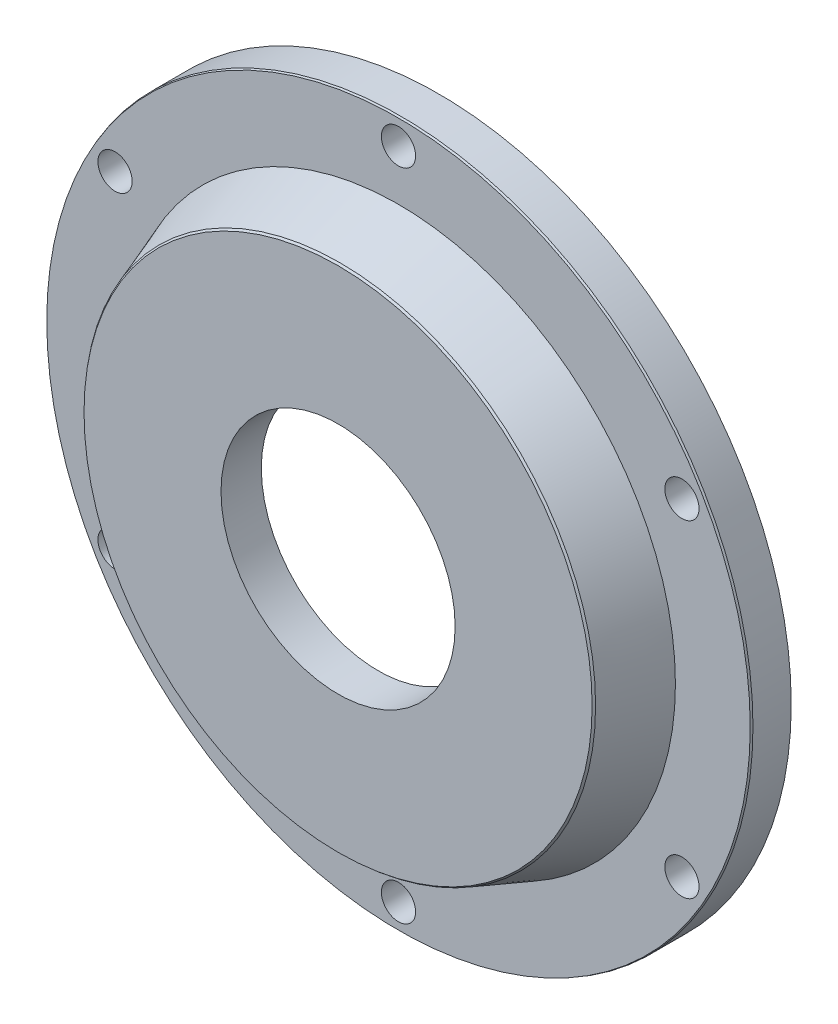
ISO-10303-21;
HEADER;
FILE_DESCRIPTION(('STEP AP214'),'2;1');
FILE_NAME('part.step','',(''),(''),'','','');
FILE_SCHEMA(('AUTOMOTIVE_DESIGN { 1 0 10303 214 1 1 1 1 }'));
ENDSEC;
DATA;
#1=APPLICATION_CONTEXT('core data for automotive mechanical design processes');
#2=APPLICATION_PROTOCOL_DEFINITION('international standard','automotive_design',2000,#1);
#3=PRODUCT_CONTEXT('',#1,'mechanical');
#4=PRODUCT('Part','Part','',(#3));
#5=PRODUCT_RELATED_PRODUCT_CATEGORY('part','',(#4));
#6=PRODUCT_DEFINITION_FORMATION('','',#4);
#7=PRODUCT_DEFINITION_CONTEXT('part definition',#1,'design');
#8=PRODUCT_DEFINITION('design','',#6,#7);
#9=PRODUCT_DEFINITION_SHAPE('','',#8);
#10=(LENGTH_UNIT() NAMED_UNIT(*) SI_UNIT(.MILLI.,.METRE.));
#11=(NAMED_UNIT(*) PLANE_ANGLE_UNIT() SI_UNIT($,.RADIAN.));
#12=(NAMED_UNIT(*) SI_UNIT($,.STERADIAN.) SOLID_ANGLE_UNIT());
#13=UNCERTAINTY_MEASURE_WITH_UNIT(LENGTH_MEASURE(1.E-05),#10,'distance_accuracy_value','');
#14=(GEOMETRIC_REPRESENTATION_CONTEXT(3) GLOBAL_UNCERTAINTY_ASSIGNED_CONTEXT((#13)) GLOBAL_UNIT_ASSIGNED_CONTEXT((#10,
#11,#12)) REPRESENTATION_CONTEXT('',''));
#15=CARTESIAN_POINT('',(0.,0.,0.));
#16=DIRECTION('',(0.,0.,1.));
#17=DIRECTION('',(1.,0.,0.));
#18=AXIS2_PLACEMENT_3D('',#15,#16,#17);
#19=CARTESIAN_POINT('',(0.,0.,-10.));
#20=DIRECTION('',(0.,0.,1.));
#21=DIRECTION('',(1.,0.,0.));
#22=AXIS2_PLACEMENT_3D('',#19,#20,#21);
#23=CYLINDRICAL_SURFACE('',#22,35.);
#24=CARTESIAN_POINT('',(0.,0.,-6.19999999999998));
#25=DIRECTION('',(0.,0.,1.));
#26=DIRECTION('',(1.,0.,0.));
#27=AXIS2_PLACEMENT_3D('',#24,#25,#26);
#28=CIRCLE('',#27,35.);
#29=CARTESIAN_POINT('',(-35.,0.,-6.19999999999998));
#30=VERTEX_POINT('',#29);
#31=EDGE_CURVE('E10',#30,#30,#28,.F.);
#32=ORIENTED_EDGE('',*,*,#31,.T.);
#33=EDGE_LOOP('',(#32));
#34=FACE_BOUND('',#33,.T.);
#35=CARTESIAN_POINT('',(0.,0.,-10.));
#36=DIRECTION('',(0.,0.,1.));
#37=DIRECTION('',(1.,0.,0.));
#38=AXIS2_PLACEMENT_3D('',#35,#36,#37);
#39=CIRCLE('',#38,35.);
#40=CARTESIAN_POINT('',(35.,0.,-10.));
#41=VERTEX_POINT('',#40);
#42=EDGE_CURVE('E70',#41,#41,#39,.T.);
#43=ORIENTED_EDGE('',*,*,#42,.T.);
#44=EDGE_LOOP('',(#43));
#45=FACE_BOUND('',#44,.T.);
#46=ADVANCED_FACE('F41',(#34,#45),#23,.T.);
#47=CARTESIAN_POINT('',(0.,0.,-10.));
#48=DIRECTION('',(0.,0.,1.));
#49=DIRECTION('',(1.,0.,0.));
#50=AXIS2_PLACEMENT_3D('',#47,#48,#49);
#51=PLANE('',#50);
#52=CARTESIAN_POINT('',(28.1458256229941,16.2500000000003,-10.));
#53=DIRECTION('',(0.,0.,1.));
#54=DIRECTION('',(1.,0.,0.));
#55=AXIS2_PLACEMENT_3D('',#52,#53,#54);
#56=CIRCLE('',#55,1.69999999999999);
#57=CARTESIAN_POINT('',(29.8458256229941,16.2500000000003,-10.));
#58=VERTEX_POINT('',#57);
#59=EDGE_CURVE('E113',#58,#58,#56,.T.);
#60=ORIENTED_EDGE('',*,*,#59,.T.);
#61=EDGE_LOOP('',(#60));
#62=FACE_BOUND('',#61,.T.);
#63=CARTESIAN_POINT('',(28.1458256229944,-16.2499999999997,-10.));
#64=DIRECTION('',(0.,0.,1.));
#65=DIRECTION('',(1.,0.,0.));
#66=AXIS2_PLACEMENT_3D('',#63,#64,#65);
#67=CIRCLE('',#66,1.69999999999999);
#68=CARTESIAN_POINT('',(29.8458256229944,-16.2499999999997,-10.));
#69=VERTEX_POINT('',#68);
#70=EDGE_CURVE('E110',#69,#69,#67,.T.);
#71=ORIENTED_EDGE('',*,*,#70,.T.);
#72=EDGE_LOOP('',(#71));
#73=FACE_BOUND('',#72,.T.);
#74=CARTESIAN_POINT('',(0.,-32.5,-10.));
#75=DIRECTION('',(0.,0.,1.));
#76=DIRECTION('',(1.,0.,0.));
#77=AXIS2_PLACEMENT_3D('',#74,#75,#76);
#78=CIRCLE('',#77,1.69999999999999);
#79=CARTESIAN_POINT('',(1.69999999999999,-32.5,-10.));
#80=VERTEX_POINT('',#79);
#81=EDGE_CURVE('E103',#80,#80,#78,.T.);
#82=ORIENTED_EDGE('',*,*,#81,.T.);
#83=EDGE_LOOP('',(#82));
#84=FACE_BOUND('',#83,.T.);
#85=CARTESIAN_POINT('',(-28.1458256229942,-16.2500000000001,-10.));
#86=DIRECTION('',(0.,0.,1.));
#87=DIRECTION('',(1.,0.,0.));
#88=AXIS2_PLACEMENT_3D('',#85,#86,#87);
#89=CIRCLE('',#88,1.69999999999999);
#90=CARTESIAN_POINT('',(-26.4458256229942,-16.2500000000001,-10.));
#91=VERTEX_POINT('',#90);
#92=EDGE_CURVE('E94',#91,#91,#89,.T.);
#93=ORIENTED_EDGE('',*,*,#92,.T.);
#94=EDGE_LOOP('',(#93));
#95=FACE_BOUND('',#94,.T.);
#96=CARTESIAN_POINT('',(-28.1458256229943,16.2499999999999,-10.));
#97=DIRECTION('',(0.,0.,1.));
#98=DIRECTION('',(1.,0.,0.));
#99=AXIS2_PLACEMENT_3D('',#96,#97,#98);
#100=CIRCLE('',#99,1.69999999999999);
#101=CARTESIAN_POINT('',(-26.4458256229943,16.2499999999999,-10.));
#102=VERTEX_POINT('',#101);
#103=EDGE_CURVE('E86',#102,#102,#100,.T.);
#104=ORIENTED_EDGE('',*,*,#103,.T.);
#105=EDGE_LOOP('',(#104));
#106=FACE_BOUND('',#105,.T.);
#107=CARTESIAN_POINT('',(0.,32.5,-10.));
#108=DIRECTION('',(0.,0.,1.));
#109=DIRECTION('',(1.,0.,0.));
#110=AXIS2_PLACEMENT_3D('',#107,#108,#109);
#111=CIRCLE('',#110,1.69999999999999);
#112=CARTESIAN_POINT('',(1.69999999999999,32.5,-10.));
#113=VERTEX_POINT('',#112);
#114=EDGE_CURVE('E82',#113,#113,#111,.T.);
#115=ORIENTED_EDGE('',*,*,#114,.T.);
#116=EDGE_LOOP('',(#115));
#117=FACE_BOUND('',#116,.T.);
#118=CARTESIAN_POINT('',(0.,0.,-10.));
#119=DIRECTION('',(0.,0.,1.));
#120=DIRECTION('',(1.,0.,0.));
#121=AXIS2_PLACEMENT_3D('',#118,#119,#120);
#122=CIRCLE('',#121,30.);
#123=CARTESIAN_POINT('',(-30.,0.,-10.));
#124=VERTEX_POINT('',#123);
#125=EDGE_CURVE('E64',#124,#124,#122,.T.);
#126=ORIENTED_EDGE('',*,*,#125,.T.);
#127=EDGE_LOOP('',(#126));
#128=FACE_BOUND('',#127,.T.);
#129=ORIENTED_EDGE('',*,*,#42,.F.);
#130=EDGE_LOOP('',(#129));
#131=FACE_BOUND('',#130,.T.);
#132=ADVANCED_FACE('F157',(#62,#73,#84,#95,#106,#117,#128,#131),#51,.F.);
#133=CARTESIAN_POINT('',(0.,0.,-4.));
#134=DIRECTION('',(0.,0.,-1.));
#135=DIRECTION('',(-1.,0.,0.));
#136=AXIS2_PLACEMENT_3D('',#133,#134,#135);
#137=CYLINDRICAL_SURFACE('',#136,26.5);
#138=CARTESIAN_POINT('',(0.,0.,-6.5));
#139=DIRECTION('',(0.,0.,1.));
#140=DIRECTION('',(1.,0.,0.));
#141=AXIS2_PLACEMENT_3D('',#138,#139,#140);
#142=CIRCLE('',#141,26.5);
#143=CARTESIAN_POINT('',(-26.5,0.,-6.5));
#144=VERTEX_POINT('',#143);
#145=EDGE_CURVE('E61',#144,#144,#142,.F.);
#146=ORIENTED_EDGE('',*,*,#145,.T.);
#147=EDGE_LOOP('',(#146));
#148=FACE_BOUND('',#147,.T.);
#149=CARTESIAN_POINT('',(0.,0.,-4.));
#150=DIRECTION('',(0.,0.,-1.));
#151=DIRECTION('',(-1.,0.,0.));
#152=AXIS2_PLACEMENT_3D('',#149,#150,#151);
#153=CIRCLE('',#152,26.5);
#154=CARTESIAN_POINT('',(-26.5,0.,-4.));
#155=VERTEX_POINT('',#154);
#156=EDGE_CURVE('E72',#155,#155,#153,.T.);
#157=ORIENTED_EDGE('',*,*,#156,.F.);
#158=EDGE_LOOP('',(#157));
#159=FACE_BOUND('',#158,.T.);
#160=ADVANCED_FACE('F165',(#148,#159),#137,.F.);
#161=CARTESIAN_POINT('',(0.,0.,-4.));
#162=DIRECTION('',(0.,0.,-1.));
#163=DIRECTION('',(-1.,0.,0.));
#164=AXIS2_PLACEMENT_3D('',#161,#162,#163);
#165=PLANE('',#164);
#166=CARTESIAN_POINT('',(0.,0.,-4.));
#167=DIRECTION('',(0.,0.,-1.));
#168=DIRECTION('',(-1.,0.,0.));
#169=AXIS2_PLACEMENT_3D('',#166,#167,#168);
#170=CIRCLE('',#169,11.625);
#171=CARTESIAN_POINT('',(-11.625,0.,-4.));
#172=VERTEX_POINT('',#171);
#173=EDGE_CURVE('E80',#172,#172,#170,.T.);
#174=ORIENTED_EDGE('',*,*,#173,.F.);
#175=EDGE_LOOP('',(#174));
#176=FACE_BOUND('',#175,.T.);
#177=ORIENTED_EDGE('',*,*,#156,.T.);
#178=EDGE_LOOP('',(#177));
#179=FACE_BOUND('',#178,.T.);
#180=ADVANCED_FACE('F175',(#176,#179),#165,.T.);
#181=CARTESIAN_POINT('',(0.,0.,-6.5));
#182=DIRECTION('',(0.,0.,-1.));
#183=DIRECTION('',(-1.,0.,0.));
#184=AXIS2_PLACEMENT_3D('',#181,#182,#183);
#185=CONICAL_SURFACE('',#184,26.5,0.785398163397449);
#186=CARTESIAN_POINT('',(-30.,0.,-10.));
#187=CARTESIAN_POINT('',(-29.9635416666667,0.,-9.96354166666667));
#188=CARTESIAN_POINT('',(-29.9270833333333,0.,-9.92708333333333));
#189=CARTESIAN_POINT('',(-29.8541666666667,0.,-9.85416666666667));
#190=CARTESIAN_POINT('',(-29.8177083333333,0.,-9.81770833333333));
#191=CARTESIAN_POINT('',(-29.7447916666667,0.,-9.74479166666667));
#192=CARTESIAN_POINT('',(-29.7083333333333,0.,-9.70833333333333));
#193=CARTESIAN_POINT('',(-29.6354166666667,0.,-9.63541666666667));
#194=CARTESIAN_POINT('',(-29.5989583333333,0.,-9.59895833333333));
#195=CARTESIAN_POINT('',(-29.5260416666667,0.,-9.52604166666667));
#196=CARTESIAN_POINT('',(-29.4895833333333,0.,-9.48958333333333));
#197=CARTESIAN_POINT('',(-29.4166666666667,0.,-9.41666666666667));
#198=CARTESIAN_POINT('',(-29.3802083333333,0.,-9.38020833333333));
#199=CARTESIAN_POINT('',(-29.3072916666667,0.,-9.30729166666667));
#200=CARTESIAN_POINT('',(-29.2708333333333,0.,-9.27083333333333));
#201=CARTESIAN_POINT('',(-29.1979166666667,0.,-9.19791666666667));
#202=CARTESIAN_POINT('',(-29.1614583333333,0.,-9.16145833333333));
#203=CARTESIAN_POINT('',(-29.0885416666667,0.,-9.08854166666666));
#204=CARTESIAN_POINT('',(-29.0520833333333,0.,-9.05208333333333));
#205=CARTESIAN_POINT('',(-28.9791666666667,0.,-8.97916666666667));
#206=CARTESIAN_POINT('',(-28.9427083333333,0.,-8.94270833333333));
#207=CARTESIAN_POINT('',(-28.8697916666667,0.,-8.86979166666666));
#208=CARTESIAN_POINT('',(-28.8333333333333,0.,-8.83333333333333));
#209=CARTESIAN_POINT('',(-28.7604166666667,0.,-8.76041666666667));
#210=CARTESIAN_POINT('',(-28.7239583333333,0.,-8.72395833333333));
#211=CARTESIAN_POINT('',(-28.6510416666667,0.,-8.65104166666666));
#212=CARTESIAN_POINT('',(-28.6145833333333,0.,-8.61458333333333));
#213=CARTESIAN_POINT('',(-28.5416666666667,0.,-8.54166666666667));
#214=CARTESIAN_POINT('',(-28.5052083333333,0.,-8.50520833333333));
#215=CARTESIAN_POINT('',(-28.4322916666667,0.,-8.43229166666667));
#216=CARTESIAN_POINT('',(-28.3958333333333,0.,-8.39583333333333));
#217=CARTESIAN_POINT('',(-28.3229166666667,0.,-8.32291666666667));
#218=CARTESIAN_POINT('',(-28.2864583333333,0.,-8.28645833333333));
#219=CARTESIAN_POINT('',(-28.2135416666667,0.,-8.21354166666667));
#220=CARTESIAN_POINT('',(-28.1770833333333,0.,-8.17708333333333));
#221=CARTESIAN_POINT('',(-28.1041666666667,0.,-8.10416666666666));
#222=CARTESIAN_POINT('',(-28.0677083333333,0.,-8.06770833333333));
#223=CARTESIAN_POINT('',(-27.9947916666667,0.,-7.99479166666667));
#224=CARTESIAN_POINT('',(-27.9583333333333,0.,-7.95833333333333));
#225=CARTESIAN_POINT('',(-27.8854166666667,0.,-7.88541666666667));
#226=CARTESIAN_POINT('',(-27.8489583333333,0.,-7.84895833333333));
#227=CARTESIAN_POINT('',(-27.7760416666667,0.,-7.77604166666666));
#228=CARTESIAN_POINT('',(-27.7395833333333,0.,-7.73958333333333));
#229=CARTESIAN_POINT('',(-27.6666666666667,0.,-7.66666666666667));
#230=CARTESIAN_POINT('',(-27.6302083333333,0.,-7.63020833333333));
#231=CARTESIAN_POINT('',(-27.5572916666667,0.,-7.55729166666666));
#232=CARTESIAN_POINT('',(-27.5208333333333,0.,-7.52083333333333));
#233=CARTESIAN_POINT('',(-27.4479166666667,0.,-7.44791666666667));
#234=CARTESIAN_POINT('',(-27.4114583333333,0.,-7.41145833333333));
#235=CARTESIAN_POINT('',(-27.3385416666667,0.,-7.33854166666666));
#236=CARTESIAN_POINT('',(-27.3020833333333,0.,-7.30208333333333));
#237=CARTESIAN_POINT('',(-27.2291666666667,0.,-7.22916666666667));
#238=CARTESIAN_POINT('',(-27.1927083333333,0.,-7.19270833333333));
#239=CARTESIAN_POINT('',(-27.1197916666667,0.,-7.11979166666666));
#240=CARTESIAN_POINT('',(-27.0833333333333,0.,-7.08333333333333));
#241=CARTESIAN_POINT('',(-27.0104166666667,0.,-7.01041666666667));
#242=CARTESIAN_POINT('',(-26.9739583333333,0.,-6.97395833333333));
#243=CARTESIAN_POINT('',(-26.9010416666667,0.,-6.90104166666666));
#244=CARTESIAN_POINT('',(-26.8645833333333,0.,-6.86458333333333));
#245=CARTESIAN_POINT('',(-26.7916666666667,0.,-6.79166666666666));
#246=CARTESIAN_POINT('',(-26.7552083333333,0.,-6.75520833333333));
#247=CARTESIAN_POINT('',(-26.6822916666667,0.,-6.68229166666666));
#248=CARTESIAN_POINT('',(-26.6458333333333,0.,-6.64583333333333));
#249=CARTESIAN_POINT('',(-26.5729166666667,0.,-6.57291666666666));
#250=CARTESIAN_POINT('',(-26.5364583333333,0.,-6.53645833333333));
#251=CARTESIAN_POINT('',(-26.5,0.,-6.5));
#252=B_SPLINE_CURVE_WITH_KNOTS('',3,(#186,#187,#188,#189,#190,#191,#192,#193,#194,#195,#196,
#197,#198,#199,#200,#201,#202,#203,#204,#205,#206,#207,#208,#209,#210,#211,#212,#213,#214,#215,
#216,#217,#218,#219,#220,#221,#222,#223,#224,#225,#226,#227,#228,#229,#230,#231,#232,#233,#234,
#235,#236,#237,#238,#239,#240,#241,#242,#243,#244,#245,#246,#247,#248,#249,#250,#251),
.UNSPECIFIED.,.F.,.F.,(4,2,2,2,2,2,2,2,2,2,2,2,2,2,2,2,2,2,2,2,2,2,2,2,2,2,2,2,2,2,2,2,4),(0.,
0.154679608384556,0.309359216769115,0.464038825153671,0.61871843353823,0.773398041922788,
0.928077650307345,1.0827572586919,1.23743686707646,1.39211647546102,1.54679608384557,
1.70147569223013,1.85615530061469,2.01083490899925,2.16551451738381,2.32019412576836,
2.47487373415292,2.62955334253748,2.78423295092204,2.93891255930659,3.09359216769115,
3.24827177607571,3.40295138446026,3.55763099284482,3.71231060122938,3.86699020961394,
4.02166981799849,4.17634942638305,4.33102903476761,4.48570864315217,4.64038825153673,
4.79506785992128,4.94974746830584),.UNSPECIFIED.);
#253=EDGE_CURVE('BSEAM128',#124,#144,#252,.T.);
#254=ORIENTED_EDGE('',*,*,#125,.F.);
#255=ORIENTED_EDGE('',*,*,#145,.F.);
#256=ORIENTED_EDGE('',*,*,#253,.T.);
#257=ORIENTED_EDGE('',*,*,#253,.F.);
#258=EDGE_LOOP('',(#254,#256,#255,#257));
#259=FACE_BOUND('',#258,.T.);
#260=ADVANCED_FACE('F128',(#259),#185,.F.);
#261=CARTESIAN_POINT('',(0.,0.,-6.));
#262=DIRECTION('',(0.,0.,1.));
#263=DIRECTION('',(1.,0.,0.));
#264=AXIS2_PLACEMENT_3D('',#261,#262,#263);
#265=PLANE('',#264);
#266=CARTESIAN_POINT('',(0.,0.,-6.));
#267=DIRECTION('',(0.,0.,1.));
#268=DIRECTION('',(1.,0.,0.));
#269=AXIS2_PLACEMENT_3D('',#266,#267,#268);
#270=CIRCLE('',#269,34.9272059531468);
#271=CARTESIAN_POINT('',(-34.9272059531468,0.,-6.));
#272=VERTEX_POINT('',#271);
#273=EDGE_CURVE('E47',#272,#272,#270,.T.);
#274=ORIENTED_EDGE('',*,*,#273,.T.);
#275=EDGE_LOOP('',(#274));
#276=FACE_BOUND('',#275,.T.);
#277=CARTESIAN_POINT('',(28.1458256229941,16.2500000000003,-6.));
#278=DIRECTION('',(0.,0.,1.));
#279=DIRECTION('',(1.,0.,0.));
#280=AXIS2_PLACEMENT_3D('',#277,#278,#279);
#281=CIRCLE('',#280,1.69999999999999);
#282=CARTESIAN_POINT('',(29.8458256229941,16.2500000000003,-6.));
#283=VERTEX_POINT('',#282);
#284=EDGE_CURVE('E116',#283,#283,#281,.T.);
#285=ORIENTED_EDGE('',*,*,#284,.F.);
#286=EDGE_LOOP('',(#285));
#287=FACE_BOUND('',#286,.T.);
#288=CARTESIAN_POINT('',(28.1458256229944,-16.2499999999997,-6.));
#289=DIRECTION('',(0.,0.,1.));
#290=DIRECTION('',(1.,0.,0.));
#291=AXIS2_PLACEMENT_3D('',#288,#289,#290);
#292=CIRCLE('',#291,1.69999999999999);
#293=CARTESIAN_POINT('',(29.8458256229944,-16.2499999999997,-6.));
#294=VERTEX_POINT('',#293);
#295=EDGE_CURVE('E109',#294,#294,#292,.T.);
#296=ORIENTED_EDGE('',*,*,#295,.F.);
#297=EDGE_LOOP('',(#296));
#298=FACE_BOUND('',#297,.T.);
#299=CARTESIAN_POINT('',(0.,-32.5,-6.));
#300=DIRECTION('',(0.,0.,1.));
#301=DIRECTION('',(1.,0.,0.));
#302=AXIS2_PLACEMENT_3D('',#299,#300,#301);
#303=CIRCLE('',#302,1.69999999999999);
#304=CARTESIAN_POINT('',(1.69999999999999,-32.5,-6.));
#305=VERTEX_POINT('',#304);
#306=EDGE_CURVE('E104',#305,#305,#303,.T.);
#307=ORIENTED_EDGE('',*,*,#306,.F.);
#308=EDGE_LOOP('',(#307));
#309=FACE_BOUND('',#308,.T.);
#310=CARTESIAN_POINT('',(-28.1458256229942,-16.2500000000001,-6.));
#311=DIRECTION('',(0.,0.,1.));
#312=DIRECTION('',(1.,0.,0.));
#313=AXIS2_PLACEMENT_3D('',#310,#311,#312);
#314=CIRCLE('',#313,1.69999999999999);
#315=CARTESIAN_POINT('',(-26.4458256229942,-16.2500000000001,-6.));
#316=VERTEX_POINT('',#315);
#317=EDGE_CURVE('E96',#316,#316,#314,.T.);
#318=ORIENTED_EDGE('',*,*,#317,.F.);
#319=EDGE_LOOP('',(#318));
#320=FACE_BOUND('',#319,.T.);
#321=CARTESIAN_POINT('',(-28.1458256229943,16.2499999999999,-6.));
#322=DIRECTION('',(0.,0.,1.));
#323=DIRECTION('',(1.,0.,0.));
#324=AXIS2_PLACEMENT_3D('',#321,#322,#323);
#325=CIRCLE('',#324,1.69999999999999);
#326=CARTESIAN_POINT('',(-26.4458256229943,16.2499999999999,-6.));
#327=VERTEX_POINT('',#326);
#328=EDGE_CURVE('E95',#327,#327,#325,.T.);
#329=ORIENTED_EDGE('',*,*,#328,.F.);
#330=EDGE_LOOP('',(#329));
#331=FACE_BOUND('',#330,.T.);
#332=CARTESIAN_POINT('',(0.,32.5,-6.));
#333=DIRECTION('',(0.,0.,1.));
#334=DIRECTION('',(1.,0.,0.));
#335=AXIS2_PLACEMENT_3D('',#332,#333,#334);
#336=CIRCLE('',#335,1.69999999999999);
#337=CARTESIAN_POINT('',(1.69999999999999,32.5,-6.));
#338=VERTEX_POINT('',#337);
#339=EDGE_CURVE('E87',#338,#338,#336,.T.);
#340=ORIENTED_EDGE('',*,*,#339,.F.);
#341=EDGE_LOOP('',(#340));
#342=FACE_BOUND('',#341,.T.);
#343=CARTESIAN_POINT('',(0.,0.,-6.));
#344=DIRECTION('',(0.,0.,1.));
#345=DIRECTION('',(1.,0.,0.));
#346=AXIS2_PLACEMENT_3D('',#343,#344,#345);
#347=CIRCLE('',#346,27.5);
#348=CARTESIAN_POINT('',(27.5,0.,-6.));
#349=VERTEX_POINT('',#348);
#350=EDGE_CURVE('E71',#349,#349,#347,.T.);
#351=ORIENTED_EDGE('',*,*,#350,.F.);
#352=EDGE_LOOP('',(#351));
#353=FACE_BOUND('',#352,.T.);
#354=ADVANCED_FACE('F125',(#276,#287,#298,#309,#320,#331,#342,#353),#265,.T.);
#355=CARTESIAN_POINT('',(0.,0.,0.));
#356=DIRECTION('',(0.,0.,1.));
#357=DIRECTION('',(1.,0.,0.));
#358=AXIS2_PLACEMENT_3D('',#355,#356,#357);
#359=PLANE('',#358);
#360=CARTESIAN_POINT('',(0.,0.,0.));
#361=DIRECTION('',(0.,0.,1.));
#362=DIRECTION('',(1.,0.,0.));
#363=AXIS2_PLACEMENT_3D('',#360,#361,#362);
#364=CIRCLE('',#363,25.2268834767636);
#365=CARTESIAN_POINT('',(25.2268834767636,0.,0.));
#366=VERTEX_POINT('',#365);
#367=EDGE_CURVE('E60',#366,#366,#364,.T.);
#368=ORIENTED_EDGE('',*,*,#367,.T.);
#369=EDGE_LOOP('',(#368));
#370=FACE_BOUND('',#369,.T.);
#371=CARTESIAN_POINT('',(0.,0.,0.));
#372=DIRECTION('',(0.,0.,1.));
#373=DIRECTION('',(1.,0.,0.));
#374=AXIS2_PLACEMENT_3D('',#371,#372,#373);
#375=CIRCLE('',#374,11.625);
#376=CARTESIAN_POINT('',(11.625,0.,0.));
#377=VERTEX_POINT('',#376);
#378=EDGE_CURVE('E78',#377,#377,#375,.T.);
#379=ORIENTED_EDGE('',*,*,#378,.F.);
#380=EDGE_LOOP('',(#379));
#381=FACE_BOUND('',#380,.T.);
#382=ADVANCED_FACE('F123',(#370,#381),#359,.T.);
#383=CARTESIAN_POINT('',(0.,0.,0.));
#384=DIRECTION('',(0.,0.,-1.));
#385=DIRECTION('',(-1.,0.,0.));
#386=AXIS2_PLACEMENT_3D('',#383,#384,#385);
#387=CONICAL_SURFACE('',#386,25.3161785944028,0.349065850398863);
#388=CARTESIAN_POINT('',(0.,0.,-0.187938524157216));
#389=DIRECTION('',(0.,0.,1.));
#390=DIRECTION('',(1.,0.,0.));
#391=AXIS2_PLACEMENT_3D('',#388,#389,#390);
#392=CIRCLE('',#391,25.3845826230679);
#393=CARTESIAN_POINT('',(25.3845826230679,0.,-0.187938524157216));
#394=VERTEX_POINT('',#393);
#395=EDGE_CURVE('E52',#394,#394,#392,.F.);
#396=ORIENTED_EDGE('',*,*,#395,.T.);
#397=EDGE_LOOP('',(#396));
#398=FACE_BOUND('',#397,.T.);
#399=ORIENTED_EDGE('',*,*,#350,.T.);
#400=EDGE_LOOP('',(#399));
#401=FACE_BOUND('',#400,.T.);
#402=ADVANCED_FACE('F138',(#398,#401),#387,.T.);
#403=CARTESIAN_POINT('',(0.,0.,-6.));
#404=DIRECTION('',(0.,0.,1.));
#405=DIRECTION('',(1.,0.,0.));
#406=AXIS2_PLACEMENT_3D('',#403,#404,#405);
#407=CYLINDRICAL_SURFACE('',#406,11.625);
#408=ORIENTED_EDGE('',*,*,#173,.T.);
#409=EDGE_LOOP('',(#408));
#410=FACE_BOUND('',#409,.T.);
#411=ORIENTED_EDGE('',*,*,#378,.T.);
#412=EDGE_LOOP('',(#411));
#413=FACE_BOUND('',#412,.T.);
#414=ADVANCED_FACE('F145',(#410,#413),#407,.F.);
#415=CARTESIAN_POINT('',(0.,32.5,-6.));
#416=DIRECTION('',(0.,0.,1.));
#417=DIRECTION('',(1.,0.,0.));
#418=AXIS2_PLACEMENT_3D('',#415,#416,#417);
#419=CYLINDRICAL_SURFACE('',#418,1.69999999999999);
#420=ORIENTED_EDGE('',*,*,#114,.F.);
#421=EDGE_LOOP('',(#420));
#422=FACE_BOUND('',#421,.T.);
#423=ORIENTED_EDGE('',*,*,#339,.T.);
#424=EDGE_LOOP('',(#423));
#425=FACE_BOUND('',#424,.T.);
#426=ADVANCED_FACE('F146',(#422,#425),#419,.F.);
#427=CARTESIAN_POINT('',(-28.1458256229943,16.2499999999999,-6.));
#428=DIRECTION('',(0.,0.,1.));
#429=DIRECTION('',(1.,0.,0.));
#430=AXIS2_PLACEMENT_3D('',#427,#428,#429);
#431=CYLINDRICAL_SURFACE('',#430,1.69999999999999);
#432=ORIENTED_EDGE('',*,*,#103,.F.);
#433=EDGE_LOOP('',(#432));
#434=FACE_BOUND('',#433,.T.);
#435=ORIENTED_EDGE('',*,*,#328,.T.);
#436=EDGE_LOOP('',(#435));
#437=FACE_BOUND('',#436,.T.);
#438=ADVANCED_FACE('F192',(#434,#437),#431,.F.);
#439=CARTESIAN_POINT('',(-28.1458256229942,-16.2500000000001,-6.));
#440=DIRECTION('',(0.,0.,1.));
#441=DIRECTION('',(1.,0.,0.));
#442=AXIS2_PLACEMENT_3D('',#439,#440,#441);
#443=CYLINDRICAL_SURFACE('',#442,1.69999999999999);
#444=ORIENTED_EDGE('',*,*,#92,.F.);
#445=EDGE_LOOP('',(#444));
#446=FACE_BOUND('',#445,.T.);
#447=ORIENTED_EDGE('',*,*,#317,.T.);
#448=EDGE_LOOP('',(#447));
#449=FACE_BOUND('',#448,.T.);
#450=ADVANCED_FACE('F196',(#446,#449),#443,.F.);
#451=CARTESIAN_POINT('',(0.,-32.5,-6.));
#452=DIRECTION('',(0.,0.,1.));
#453=DIRECTION('',(1.,0.,0.));
#454=AXIS2_PLACEMENT_3D('',#451,#452,#453);
#455=CYLINDRICAL_SURFACE('',#454,1.69999999999999);
#456=ORIENTED_EDGE('',*,*,#81,.F.);
#457=EDGE_LOOP('',(#456));
#458=FACE_BOUND('',#457,.T.);
#459=ORIENTED_EDGE('',*,*,#306,.T.);
#460=EDGE_LOOP('',(#459));
#461=FACE_BOUND('',#460,.T.);
#462=ADVANCED_FACE('F202',(#458,#461),#455,.F.);
#463=CARTESIAN_POINT('',(28.1458256229944,-16.2499999999997,-6.));
#464=DIRECTION('',(0.,0.,1.));
#465=DIRECTION('',(1.,0.,0.));
#466=AXIS2_PLACEMENT_3D('',#463,#464,#465);
#467=CYLINDRICAL_SURFACE('',#466,1.69999999999999);
#468=ORIENTED_EDGE('',*,*,#70,.F.);
#469=EDGE_LOOP('',(#468));
#470=FACE_BOUND('',#469,.T.);
#471=ORIENTED_EDGE('',*,*,#295,.T.);
#472=EDGE_LOOP('',(#471));
#473=FACE_BOUND('',#472,.T.);
#474=ADVANCED_FACE('F203',(#470,#473),#467,.F.);
#475=CARTESIAN_POINT('',(28.1458256229941,16.2500000000003,-6.));
#476=DIRECTION('',(0.,0.,1.));
#477=DIRECTION('',(1.,0.,0.));
#478=AXIS2_PLACEMENT_3D('',#475,#476,#477);
#479=CYLINDRICAL_SURFACE('',#478,1.69999999999999);
#480=ORIENTED_EDGE('',*,*,#59,.F.);
#481=EDGE_LOOP('',(#480));
#482=FACE_BOUND('',#481,.T.);
#483=ORIENTED_EDGE('',*,*,#284,.T.);
#484=EDGE_LOOP('',(#483));
#485=FACE_BOUND('',#484,.T.);
#486=ADVANCED_FACE('F119',(#482,#485),#479,.F.);
#487=CARTESIAN_POINT('',(0.,0.,0.));
#488=DIRECTION('',(0.,0.,-1.));
#489=DIRECTION('',(-1.,0.,0.));
#490=AXIS2_PLACEMENT_3D('',#487,#488,#489);
#491=CONICAL_SURFACE('',#490,25.2268834767636,0.698131700797742);
#492=ORIENTED_EDGE('',*,*,#395,.F.);
#493=EDGE_LOOP('',(#492));
#494=FACE_BOUND('',#493,.T.);
#495=ORIENTED_EDGE('',*,*,#367,.F.);
#496=EDGE_LOOP('',(#495));
#497=FACE_BOUND('',#496,.T.);
#498=ADVANCED_FACE('F208',(#494,#497),#491,.T.);
#499=CARTESIAN_POINT('',(0.,0.,-6.));
#500=DIRECTION('',(0.,0.,-1.));
#501=DIRECTION('',(-1.,0.,0.));
#502=AXIS2_PLACEMENT_3D('',#499,#500,#501);
#503=CONICAL_SURFACE('',#502,34.9272059531468,0.349065850398858);
#504=CARTESIAN_POINT('',(-35.,0.,-6.19999999999998));
#505=CARTESIAN_POINT('',(-34.9992417286786,0.,-6.19791666666665));
#506=CARTESIAN_POINT('',(-34.9984834573572,0.,-6.19583333333331));
#507=CARTESIAN_POINT('',(-34.9969669147144,0.,-6.19166666666665));
#508=CARTESIAN_POINT('',(-34.9962086433931,0.,-6.18958333333331));
#509=CARTESIAN_POINT('',(-34.9946921007503,0.,-6.18541666666665));
#510=CARTESIAN_POINT('',(-34.9939338294289,0.,-6.18333333333331));
#511=CARTESIAN_POINT('',(-34.9924172867861,0.,-6.17916666666665));
#512=CARTESIAN_POINT('',(-34.9916590154647,0.,-6.17708333333331));
#513=CARTESIAN_POINT('',(-34.990142472822,0.,-6.17291666666665));
#514=CARTESIAN_POINT('',(-34.9893842015006,0.,-6.17083333333332));
#515=CARTESIAN_POINT('',(-34.9878676588578,0.,-6.16666666666665));
#516=CARTESIAN_POINT('',(-34.9871093875364,0.,-6.16458333333332));
#517=CARTESIAN_POINT('',(-34.9855928448936,0.,-6.16041666666665));
#518=CARTESIAN_POINT('',(-34.9848345735722,0.,-6.15833333333332));
#519=CARTESIAN_POINT('',(-34.9833180309295,0.,-6.15416666666665));
#520=CARTESIAN_POINT('',(-34.9825597596081,0.,-6.15208333333332));
#521=CARTESIAN_POINT('',(-34.9810432169653,0.,-6.14791666666665));
#522=CARTESIAN_POINT('',(-34.9802849456439,0.,-6.14583333333332));
#523=CARTESIAN_POINT('',(-34.9787684030011,0.,-6.14166666666665));
#524=CARTESIAN_POINT('',(-34.9780101316797,0.,-6.13958333333332));
#525=CARTESIAN_POINT('',(-34.976493589037,0.,-6.13541666666665));
#526=CARTESIAN_POINT('',(-34.9757353177156,0.,-6.13333333333332));
#527=CARTESIAN_POINT('',(-34.9742187750728,0.,-6.12916666666665));
#528=CARTESIAN_POINT('',(-34.9734605037514,0.,-6.12708333333332));
#529=CARTESIAN_POINT('',(-34.9719439611087,0.,-6.12291666666665));
#530=CARTESIAN_POINT('',(-34.9711856897873,0.,-6.12083333333332));
#531=CARTESIAN_POINT('',(-34.9696691471445,0.,-6.11666666666665));
#532=CARTESIAN_POINT('',(-34.9689108758231,0.,-6.11458333333332));
#533=CARTESIAN_POINT('',(-34.9673943331803,0.,-6.11041666666666));
#534=CARTESIAN_POINT('',(-34.9666360618589,0.,-6.10833333333332));
#535=CARTESIAN_POINT('',(-34.9651195192162,0.,-6.10416666666666));
#536=CARTESIAN_POINT('',(-34.9643612478948,0.,-6.10208333333332));
#537=CARTESIAN_POINT('',(-34.962844705252,0.,-6.09791666666666));
#538=CARTESIAN_POINT('',(-34.9620864339306,0.,-6.09583333333332));
#539=CARTESIAN_POINT('',(-34.9605698912878,0.,-6.09166666666666));
#540=CARTESIAN_POINT('',(-34.9598116199664,0.,-6.08958333333332));
#541=CARTESIAN_POINT('',(-34.9582950773237,0.,-6.08541666666666));
#542=CARTESIAN_POINT('',(-34.9575368060023,0.,-6.08333333333333));
#543=CARTESIAN_POINT('',(-34.9560202633595,0.,-6.07916666666666));
#544=CARTESIAN_POINT('',(-34.9552619920381,0.,-6.07708333333333));
#545=CARTESIAN_POINT('',(-34.9537454493953,0.,-6.07291666666666));
#546=CARTESIAN_POINT('',(-34.9529871780739,0.,-6.07083333333333));
#547=CARTESIAN_POINT('',(-34.9514706354312,0.,-6.06666666666666));
#548=CARTESIAN_POINT('',(-34.9507123641098,0.,-6.06458333333333));
#549=CARTESIAN_POINT('',(-34.949195821467,0.,-6.06041666666666));
#550=CARTESIAN_POINT('',(-34.9484375501456,0.,-6.05833333333333));
#551=CARTESIAN_POINT('',(-34.9469210075029,0.,-6.05416666666666));
#552=CARTESIAN_POINT('',(-34.9461627361815,0.,-6.05208333333333));
#553=CARTESIAN_POINT('',(-34.9446461935387,0.,-6.04791666666666));
#554=CARTESIAN_POINT('',(-34.9438879222173,0.,-6.04583333333333));
#555=CARTESIAN_POINT('',(-34.9423713795745,0.,-6.04166666666666));
#556=CARTESIAN_POINT('',(-34.9416131082531,0.,-6.03958333333333));
#557=CARTESIAN_POINT('',(-34.9400965656104,0.,-6.03541666666666));
#558=CARTESIAN_POINT('',(-34.939338294289,0.,-6.03333333333333));
#559=CARTESIAN_POINT('',(-34.9378217516462,0.,-6.02916666666666));
#560=CARTESIAN_POINT('',(-34.9370634803248,0.,-6.02708333333333));
#561=CARTESIAN_POINT('',(-34.935546937682,0.,-6.02291666666666));
#562=CARTESIAN_POINT('',(-34.9347886663606,0.,-6.02083333333333));
#563=CARTESIAN_POINT('',(-34.9332721237179,0.,-6.01666666666666));
#564=CARTESIAN_POINT('',(-34.9325138523965,0.,-6.01458333333333));
#565=CARTESIAN_POINT('',(-34.9309973097537,0.,-6.01041666666667));
#566=CARTESIAN_POINT('',(-34.9302390384323,0.,-6.00833333333333));
#567=CARTESIAN_POINT('',(-34.9287224957895,0.,-6.00416666666667));
#568=CARTESIAN_POINT('',(-34.9279642244681,0.,-6.00208333333333));
#569=CARTESIAN_POINT('',(-34.9272059531468,0.,-6.));
#570=B_SPLINE_CURVE_WITH_KNOTS('',3,(#504,#505,#506,#507,#508,#509,#510,#511,#512,#513,#514,
#515,#516,#517,#518,#519,#520,#521,#522,#523,#524,#525,#526,#527,#528,#529,#530,#531,#532,#533,
#534,#535,#536,#537,#538,#539,#540,#541,#542,#543,#544,#545,#546,#547,#548,#549,#550,#551,#552,
#553,#554,#555,#556,#557,#558,#559,#560,#561,#562,#563,#564,#565,#566,#567,#568,#569),
.UNSPECIFIED.,.F.,.F.,(4,2,2,2,2,2,2,2,2,2,2,2,2,2,2,2,2,2,2,2,2,2,2,2,2,2,2,2,2,2,2,2,4),(0.,
0.0066511110779737,0.0133022221559474,0.0199533332339211,0.0266044443118948,0.0332555553898685,
0.0399066664678422,0.0465577775458159,0.0532088886237896,0.0598599997017633,0.066511110779737,
0.0731622218577107,0.0798133329356852,0.0864644440136581,0.0931155550916318,0.0997666661696055,
0.106417777247579,0.113068888325553,0.119719999403527,0.1263711104815,0.133022221559474,
0.139673332637448,0.146324443715421,0.152975554793395,0.15962666587137,0.166277776949343,
0.172928888027317,0.179579999105291,0.186231110183264,0.192882221261238,0.199533332339212,
0.206184443417186,0.212835554495159),.UNSPECIFIED.);
#571=EDGE_CURVE('BSEAM42',#30,#272,#570,.T.);
#572=ORIENTED_EDGE('',*,*,#31,.F.);
#573=ORIENTED_EDGE('',*,*,#273,.F.);
#574=ORIENTED_EDGE('',*,*,#571,.T.);
#575=ORIENTED_EDGE('',*,*,#571,.F.);
#576=EDGE_LOOP('',(#572,#574,#573,#575));
#577=FACE_BOUND('',#576,.T.);
#578=ADVANCED_FACE('F42',(#577),#503,.T.);
#579=CLOSED_SHELL('',(#46,#132,#160,#180,#260,#354,#382,#402,#414,#426,#438,#450,#462,#474,#486,
#498,#578));
#580=MANIFOLD_SOLID_BREP('B2',#579);
#581=ADVANCED_BREP_SHAPE_REPRESENTATION('',(#18,#580),#14);
#582=SHAPE_DEFINITION_REPRESENTATION(#9,#581);
ENDSEC;
END-ISO-10303-21;
